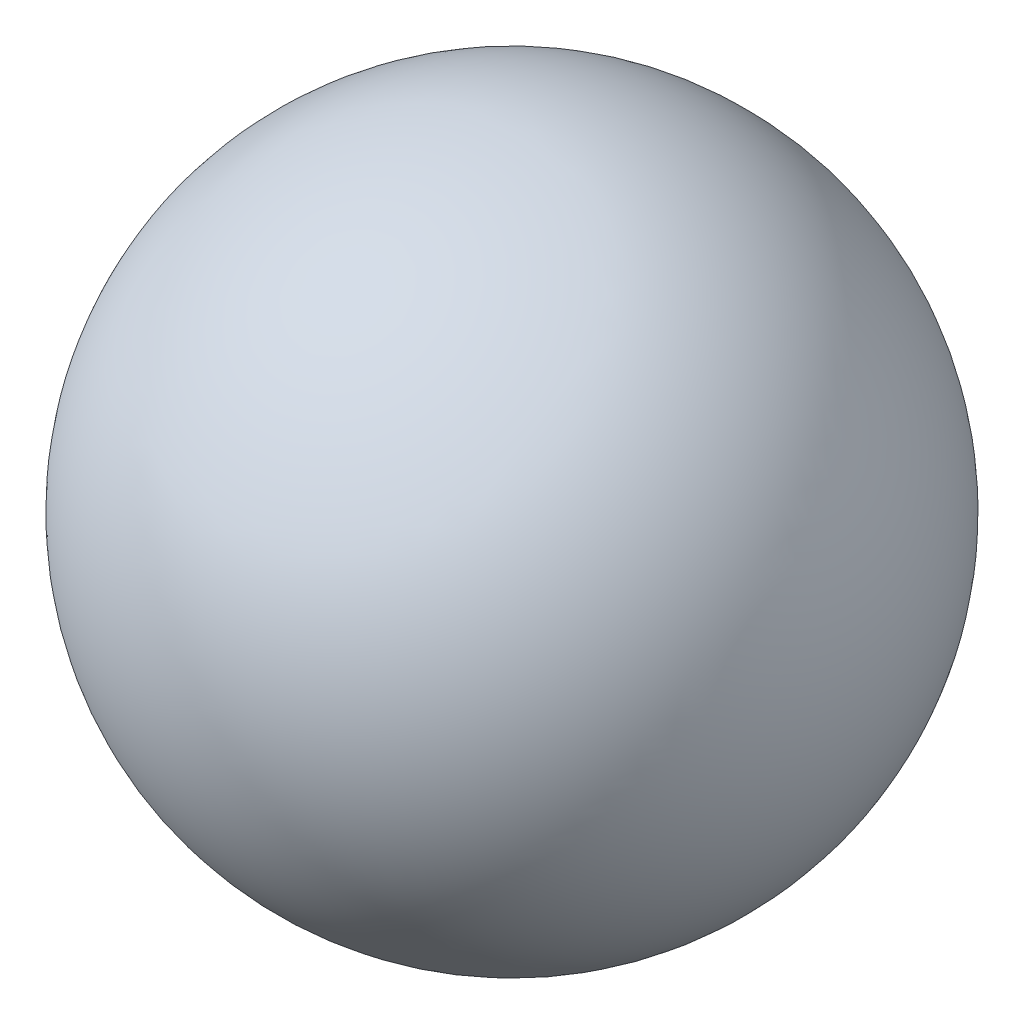
ISO-10303-21;
HEADER;
FILE_DESCRIPTION(('STEP AP214'),'2;1');
FILE_NAME('part.step','',(''),(''),'','','');
FILE_SCHEMA(('AUTOMOTIVE_DESIGN { 1 0 10303 214 1 1 1 1 }'));
ENDSEC;
DATA;
#1=APPLICATION_CONTEXT('core data for automotive mechanical design processes');
#2=APPLICATION_PROTOCOL_DEFINITION('international standard','automotive_design',2000,#1);
#3=PRODUCT_CONTEXT('',#1,'mechanical');
#4=PRODUCT('Part','Part','',(#3));
#5=PRODUCT_RELATED_PRODUCT_CATEGORY('part','',(#4));
#6=PRODUCT_DEFINITION_FORMATION('','',#4);
#7=PRODUCT_DEFINITION_CONTEXT('part definition',#1,'design');
#8=PRODUCT_DEFINITION('design','',#6,#7);
#9=PRODUCT_DEFINITION_SHAPE('','',#8);
#10=(LENGTH_UNIT() NAMED_UNIT(*) SI_UNIT(.MILLI.,.METRE.));
#11=(NAMED_UNIT(*) PLANE_ANGLE_UNIT() SI_UNIT($,.RADIAN.));
#12=(NAMED_UNIT(*) SI_UNIT($,.STERADIAN.) SOLID_ANGLE_UNIT());
#13=UNCERTAINTY_MEASURE_WITH_UNIT(LENGTH_MEASURE(1.E-05),#10,'distance_accuracy_value','');
#14=(GEOMETRIC_REPRESENTATION_CONTEXT(3) GLOBAL_UNCERTAINTY_ASSIGNED_CONTEXT((#13)) GLOBAL_UNIT_ASSIGNED_CONTEXT((#10,
#11,#12)) REPRESENTATION_CONTEXT('',''));
#15=CARTESIAN_POINT('',(0.,0.,0.));
#16=DIRECTION('',(0.,0.,1.));
#17=DIRECTION('',(1.,0.,0.));
#18=AXIS2_PLACEMENT_3D('',#15,#16,#17);
#19=CARTESIAN_POINT('',(0.,0.,0.));
#20=DIRECTION('',(-1.,0.,0.));
#21=DIRECTION('',(0.,1.,0.));
#22=AXIS2_PLACEMENT_3D('',#19,#20,#21);
#23=SPHERICAL_SURFACE('',#22,60.);
#24=CARTESIAN_POINT('',(-60.,0.,0.));
#25=VERTEX_POINT('',#24);
#26=VERTEX_LOOP('',#25);
#27=FACE_BOUND('',#26,.T.);
#28=ADVANCED_FACE('F29',(#27),#23,.T.);
#29=CLOSED_SHELL('',(#28));
#30=MANIFOLD_SOLID_BREP('B2',#29);
#31=ADVANCED_BREP_SHAPE_REPRESENTATION('',(#18,#30),#14);
#32=SHAPE_DEFINITION_REPRESENTATION(#9,#31);
ENDSEC;
END-ISO-10303-21;
